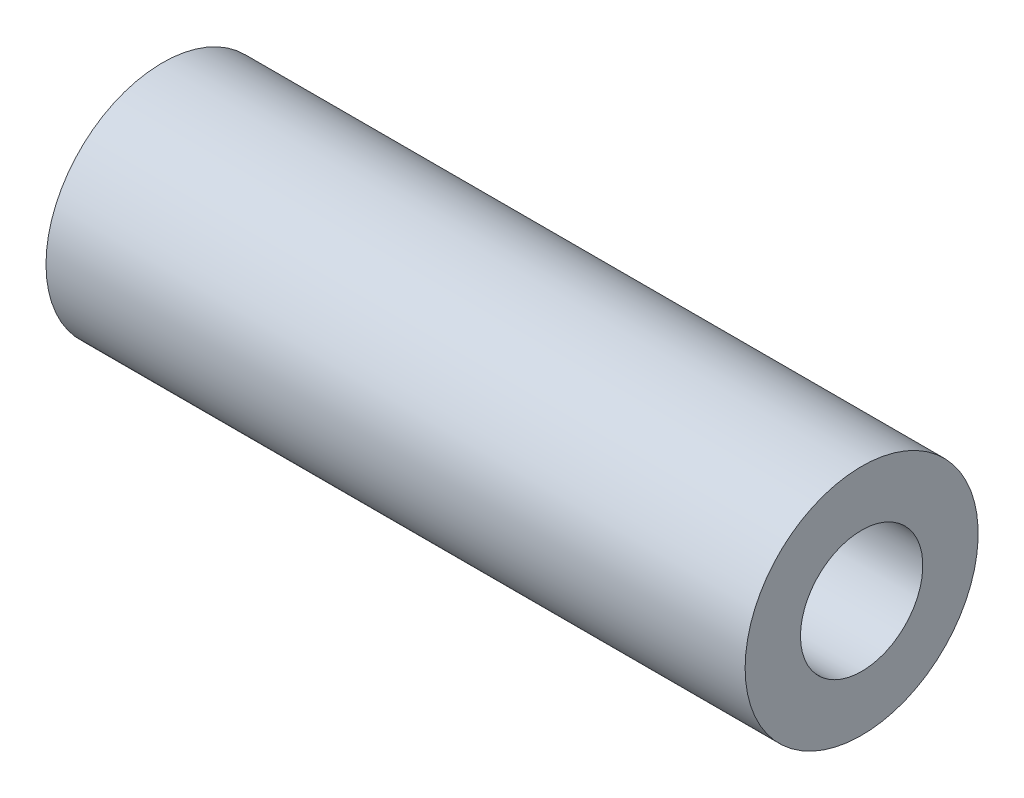
ISO-10303-21;
HEADER;
FILE_DESCRIPTION(('STEP AP214'),'2;1');
FILE_NAME('part.step','',(''),(''),'','','');
FILE_SCHEMA(('AUTOMOTIVE_DESIGN { 1 0 10303 214 1 1 1 1 }'));
ENDSEC;
DATA;
#1=APPLICATION_CONTEXT('core data for automotive mechanical design processes');
#2=APPLICATION_PROTOCOL_DEFINITION('international standard','automotive_design',2000,#1);
#3=PRODUCT_CONTEXT('',#1,'mechanical');
#4=PRODUCT('Part','Part','',(#3));
#5=PRODUCT_RELATED_PRODUCT_CATEGORY('part','',(#4));
#6=PRODUCT_DEFINITION_FORMATION('','',#4);
#7=PRODUCT_DEFINITION_CONTEXT('part definition',#1,'design');
#8=PRODUCT_DEFINITION('design','',#6,#7);
#9=PRODUCT_DEFINITION_SHAPE('','',#8);
#10=(LENGTH_UNIT() NAMED_UNIT(*) SI_UNIT(.MILLI.,.METRE.));
#11=(NAMED_UNIT(*) PLANE_ANGLE_UNIT() SI_UNIT($,.RADIAN.));
#12=(NAMED_UNIT(*) SI_UNIT($,.STERADIAN.) SOLID_ANGLE_UNIT());
#13=UNCERTAINTY_MEASURE_WITH_UNIT(LENGTH_MEASURE(1.E-05),#10,'distance_accuracy_value','');
#14=(GEOMETRIC_REPRESENTATION_CONTEXT(3) GLOBAL_UNCERTAINTY_ASSIGNED_CONTEXT((#13)) GLOBAL_UNIT_ASSIGNED_CONTEXT((#10,
#11,#12)) REPRESENTATION_CONTEXT('',''));
#15=CARTESIAN_POINT('',(0.,0.,0.));
#16=DIRECTION('',(0.,0.,1.));
#17=DIRECTION('',(1.,0.,0.));
#18=AXIS2_PLACEMENT_3D('',#15,#16,#17);
#19=CARTESIAN_POINT('',(-14.2875,0.,0.));
#20=DIRECTION('',(-1.,0.,0.));
#21=DIRECTION('',(0.,0.,1.));
#22=AXIS2_PLACEMENT_3D('',#19,#20,#21);
#23=CYLINDRICAL_SURFACE('',#22,2.5);
#24=CARTESIAN_POINT('',(14.2875,0.,0.));
#25=DIRECTION('',(-1.,0.,0.));
#26=DIRECTION('',(0.,0.,1.));
#27=AXIS2_PLACEMENT_3D('',#24,#25,#26);
#28=CIRCLE('',#27,2.5);
#29=CARTESIAN_POINT('',(14.2875,0.,2.5));
#30=VERTEX_POINT('',#29);
#31=EDGE_CURVE('E18',#30,#30,#28,.F.);
#32=ORIENTED_EDGE('',*,*,#31,.T.);
#33=EDGE_LOOP('',(#32));
#34=FACE_BOUND('',#33,.T.);
#35=CARTESIAN_POINT('',(-14.2875,0.,0.));
#36=DIRECTION('',(-1.,0.,0.));
#37=DIRECTION('',(0.,0.,1.));
#38=AXIS2_PLACEMENT_3D('',#35,#36,#37);
#39=CIRCLE('',#38,2.5);
#40=CARTESIAN_POINT('',(-14.2875,0.,2.5));
#41=VERTEX_POINT('',#40);
#42=EDGE_CURVE('E27',#41,#41,#39,.T.);
#43=ORIENTED_EDGE('',*,*,#42,.T.);
#44=EDGE_LOOP('',(#43));
#45=FACE_BOUND('',#44,.T.);
#46=ADVANCED_FACE('F15',(#34,#45),#23,.F.);
#47=CARTESIAN_POINT('',(14.2875,4.7625,0.));
#48=DIRECTION('',(-1.,0.,0.));
#49=DIRECTION('',(0.,0.,1.));
#50=AXIS2_PLACEMENT_3D('',#47,#48,#49);
#51=PLANE('',#50);
#52=ORIENTED_EDGE('',*,*,#31,.F.);
#53=EDGE_LOOP('',(#52));
#54=FACE_BOUND('',#53,.T.);
#55=CARTESIAN_POINT('',(14.2875,0.,0.));
#56=DIRECTION('',(-1.,0.,0.));
#57=DIRECTION('',(0.,0.,1.));
#58=AXIS2_PLACEMENT_3D('',#55,#56,#57);
#59=CIRCLE('',#58,4.7625);
#60=CARTESIAN_POINT('',(14.2875,0.,4.7625));
#61=VERTEX_POINT('',#60);
#62=EDGE_CURVE('E22',#61,#61,#59,.T.);
#63=ORIENTED_EDGE('',*,*,#62,.F.);
#64=EDGE_LOOP('',(#63));
#65=FACE_BOUND('',#64,.T.);
#66=ADVANCED_FACE('F36',(#54,#65),#51,.F.);
#67=CARTESIAN_POINT('',(-14.2875,4.7625,0.));
#68=DIRECTION('',(1.,0.,0.));
#69=DIRECTION('',(0.,0.,-1.));
#70=AXIS2_PLACEMENT_3D('',#67,#68,#69);
#71=PLANE('',#70);
#72=CARTESIAN_POINT('',(-14.2875,0.,0.));
#73=DIRECTION('',(-1.,0.,0.));
#74=DIRECTION('',(0.,0.,1.));
#75=AXIS2_PLACEMENT_3D('',#72,#73,#74);
#76=CIRCLE('',#75,4.7625);
#77=CARTESIAN_POINT('',(-14.2875,0.,4.7625));
#78=VERTEX_POINT('',#77);
#79=EDGE_CURVE('E10',#78,#78,#76,.F.);
#80=ORIENTED_EDGE('',*,*,#79,.F.);
#81=EDGE_LOOP('',(#80));
#82=FACE_BOUND('',#81,.T.);
#83=ORIENTED_EDGE('',*,*,#42,.F.);
#84=EDGE_LOOP('',(#83));
#85=FACE_BOUND('',#84,.T.);
#86=ADVANCED_FACE('F39',(#82,#85),#71,.F.);
#87=CARTESIAN_POINT('',(-14.2875,0.,0.));
#88=DIRECTION('',(-1.,0.,0.));
#89=DIRECTION('',(0.,0.,1.));
#90=AXIS2_PLACEMENT_3D('',#87,#88,#89);
#91=CYLINDRICAL_SURFACE('',#90,4.7625);
#92=ORIENTED_EDGE('',*,*,#79,.T.);
#93=EDGE_LOOP('',(#92));
#94=FACE_BOUND('',#93,.T.);
#95=ORIENTED_EDGE('',*,*,#62,.T.);
#96=EDGE_LOOP('',(#95));
#97=FACE_BOUND('',#96,.T.);
#98=ADVANCED_FACE('F42',(#94,#97),#91,.T.);
#99=CLOSED_SHELL('',(#46,#66,#86,#98));
#100=MANIFOLD_SOLID_BREP('B1',#99);
#101=ADVANCED_BREP_SHAPE_REPRESENTATION('',(#18,#100),#14);
#102=SHAPE_DEFINITION_REPRESENTATION(#9,#101);
ENDSEC;
END-ISO-10303-21;
